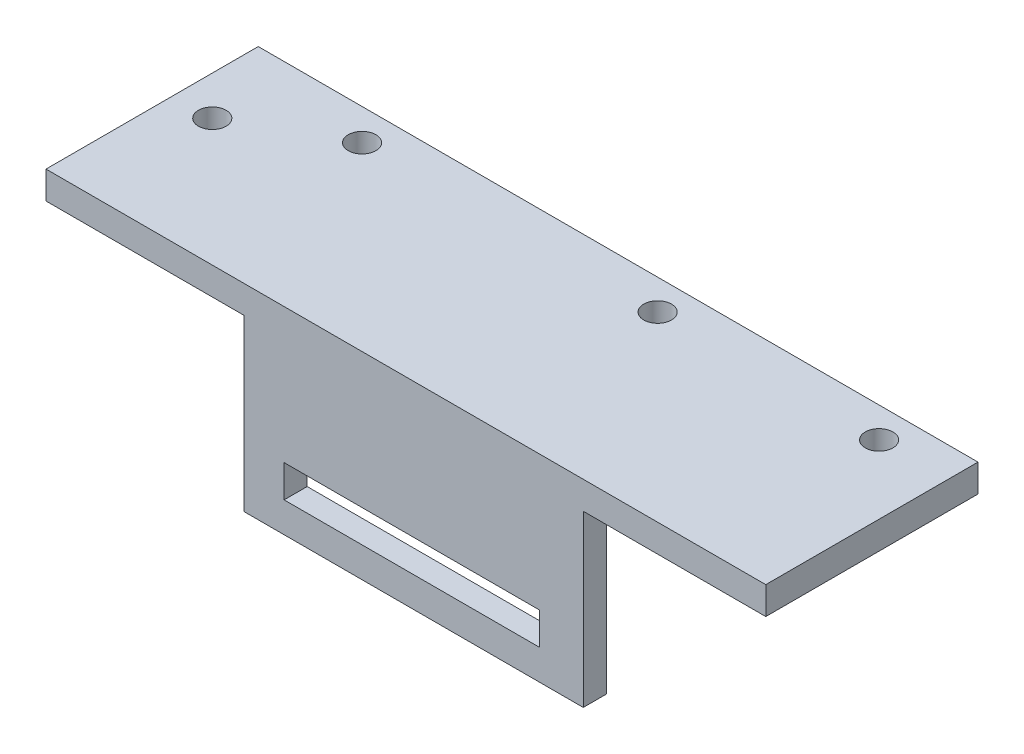
ISO-10303-21;
HEADER;
FILE_DESCRIPTION(('STEP AP214'),'2;1');
FILE_NAME('part.step','',(''),(''),'','','');
FILE_SCHEMA(('AUTOMOTIVE_DESIGN { 1 0 10303 214 1 1 1 1 }'));
ENDSEC;
DATA;
#1=APPLICATION_CONTEXT('core data for automotive mechanical design processes');
#2=APPLICATION_PROTOCOL_DEFINITION('international standard','automotive_design',2000,#1);
#3=PRODUCT_CONTEXT('',#1,'mechanical');
#4=PRODUCT('Part','Part','',(#3));
#5=PRODUCT_RELATED_PRODUCT_CATEGORY('part','',(#4));
#6=PRODUCT_DEFINITION_FORMATION('','',#4);
#7=PRODUCT_DEFINITION_CONTEXT('part definition',#1,'design');
#8=PRODUCT_DEFINITION('design','',#6,#7);
#9=PRODUCT_DEFINITION_SHAPE('','',#8);
#10=(LENGTH_UNIT() NAMED_UNIT(*) SI_UNIT(.MILLI.,.METRE.));
#11=(NAMED_UNIT(*) PLANE_ANGLE_UNIT() SI_UNIT($,.RADIAN.));
#12=(NAMED_UNIT(*) SI_UNIT($,.STERADIAN.) SOLID_ANGLE_UNIT());
#13=UNCERTAINTY_MEASURE_WITH_UNIT(LENGTH_MEASURE(1.E-05),#10,'distance_accuracy_value','');
#14=(GEOMETRIC_REPRESENTATION_CONTEXT(3) GLOBAL_UNCERTAINTY_ASSIGNED_CONTEXT((#13)) GLOBAL_UNIT_ASSIGNED_CONTEXT((#10,
#11,#12)) REPRESENTATION_CONTEXT('',''));
#15=CARTESIAN_POINT('',(0.,0.,0.));
#16=DIRECTION('',(0.,0.,1.));
#17=DIRECTION('',(1.,0.,0.));
#18=AXIS2_PLACEMENT_3D('',#15,#16,#17);
#19=CARTESIAN_POINT('',(0.,0.,0.));
#20=DIRECTION('',(0.,1.,0.));
#21=DIRECTION('',(0.,0.,1.));
#22=AXIS2_PLACEMENT_3D('',#19,#20,#21);
#23=PLANE('',#22);
#24=CARTESIAN_POINT('',(-24.35,0.,-4.1));
#25=DIRECTION('',(0.,1.,0.));
#26=DIRECTION('',(0.,0.,1.));
#27=AXIS2_PLACEMENT_3D('',#24,#25,#26);
#28=CIRCLE('',#27,1.5);
#29=CARTESIAN_POINT('',(-24.35,0.,-2.6));
#30=VERTEX_POINT('',#29);
#31=EDGE_CURVE('E321',#30,#30,#28,.T.);
#32=ORIENTED_EDGE('',*,*,#31,.T.);
#33=EDGE_LOOP('',(#32));
#34=FACE_BOUND('',#33,.T.);
#35=CARTESIAN_POINT('',(31.56,0.,-4.22169208076263));
#36=DIRECTION('',(0.,1.,0.));
#37=DIRECTION('',(0.,0.,1.));
#38=AXIS2_PLACEMENT_3D('',#35,#36,#37);
#39=CIRCLE('',#38,1.5);
#40=CARTESIAN_POINT('',(31.56,0.,-2.72169208076263));
#41=VERTEX_POINT('',#40);
#42=EDGE_CURVE('E314',#41,#41,#39,.T.);
#43=ORIENTED_EDGE('',*,*,#42,.T.);
#44=EDGE_LOOP('',(#43));
#45=FACE_BOUND('',#44,.T.);
#46=CARTESIAN_POINT('',(7.56,0.,-4.22169208076263));
#47=DIRECTION('',(0.,1.,0.));
#48=DIRECTION('',(0.,0.,1.));
#49=AXIS2_PLACEMENT_3D('',#46,#47,#48);
#50=CIRCLE('',#49,1.5);
#51=CARTESIAN_POINT('',(7.56,0.,-2.72169208076263));
#52=VERTEX_POINT('',#51);
#53=EDGE_CURVE('E296',#52,#52,#50,.T.);
#54=ORIENTED_EDGE('',*,*,#53,.T.);
#55=EDGE_LOOP('',(#54));
#56=FACE_BOUND('',#55,.T.);
#57=CARTESIAN_POINT('',(-34.76,0.,1.72));
#58=DIRECTION('',(0.,1.,0.));
#59=DIRECTION('',(0.,0.,1.));
#60=AXIS2_PLACEMENT_3D('',#57,#58,#59);
#61=CIRCLE('',#60,1.5);
#62=CARTESIAN_POINT('',(-34.76,0.,3.22));
#63=VERTEX_POINT('',#62);
#64=EDGE_CURVE('E300',#63,#63,#61,.T.);
#65=ORIENTED_EDGE('',*,*,#64,.T.);
#66=EDGE_LOOP('',(#65));
#67=FACE_BOUND('',#66,.T.);
#68=DIRECTION('',(0.,0.,-1.));
#69=VECTOR('',#68,1.);
#70=CARTESIAN_POINT('',(-17.5447148574661,0.,15.5));
#71=LINE('',#70,#69);
#72=CARTESIAN_POINT('',(-17.5447148574661,0.,15.5));
#73=VERTEX_POINT('',#72);
#74=CARTESIAN_POINT('',(-17.5447148574661,0.,13.));
#75=VERTEX_POINT('',#74);
#76=EDGE_CURVE('E203',#73,#75,#71,.T.);
#77=ORIENTED_EDGE('',*,*,#76,.F.);
#78=DIRECTION('',(-1.,0.,0.));
#79=VECTOR('',#78,1.);
#80=CARTESIAN_POINT('',(-39.,0.,15.5));
#81=LINE('',#80,#79);
#82=CARTESIAN_POINT('',(-39.,0.,15.5));
#83=VERTEX_POINT('',#82);
#84=EDGE_CURVE('E269',#73,#83,#81,.T.);
#85=ORIENTED_EDGE('',*,*,#84,.T.);
#86=DIRECTION('',(0.,0.,-1.));
#87=VECTOR('',#86,1.);
#88=CARTESIAN_POINT('',(-39.,0.,7.5));
#89=LINE('',#88,#87);
#90=CARTESIAN_POINT('',(-39.,0.,-7.5));
#91=VERTEX_POINT('',#90);
#92=EDGE_CURVE('E336',#83,#91,#89,.T.);
#93=ORIENTED_EDGE('',*,*,#92,.T.);
#94=DIRECTION('',(1.,0.,0.));
#95=VECTOR('',#94,1.);
#96=CARTESIAN_POINT('',(-39.,0.,-7.5));
#97=LINE('',#96,#95);
#98=CARTESIAN_POINT('',(39.,0.,-7.5));
#99=VERTEX_POINT('',#98);
#100=EDGE_CURVE('E304',#91,#99,#97,.T.);
#101=ORIENTED_EDGE('',*,*,#100,.T.);
#102=DIRECTION('',(0.,0.,-1.));
#103=VECTOR('',#102,1.);
#104=CARTESIAN_POINT('',(39.,0.,7.5));
#105=LINE('',#104,#103);
#106=CARTESIAN_POINT('',(39.,0.,15.5));
#107=VERTEX_POINT('',#106);
#108=EDGE_CURVE('E347',#107,#99,#105,.T.);
#109=ORIENTED_EDGE('',*,*,#108,.F.);
#110=CARTESIAN_POINT('',(19.2231892448185,0.,15.5));
#111=VERTEX_POINT('',#110);
#112=EDGE_CURVE('E276',#107,#111,#81,.T.);
#113=ORIENTED_EDGE('',*,*,#112,.T.);
#114=DIRECTION('',(0.,0.,1.));
#115=VECTOR('',#114,1.);
#116=CARTESIAN_POINT('',(19.2231892448185,0.,15.5));
#117=LINE('',#116,#115);
#118=CARTESIAN_POINT('',(19.2231892448185,0.,13.));
#119=VERTEX_POINT('',#118);
#120=EDGE_CURVE('E533',#119,#111,#117,.T.);
#121=ORIENTED_EDGE('',*,*,#120,.F.);
#122=DIRECTION('',(1.,0.,0.));
#123=VECTOR('',#122,1.);
#124=CARTESIAN_POINT('',(-17.5447148574661,0.,13.));
#125=LINE('',#124,#123);
#126=EDGE_CURVE('E531',#75,#119,#125,.T.);
#127=ORIENTED_EDGE('',*,*,#126,.F.);
#128=EDGE_LOOP('',(#77,#85,#93,#101,#109,#113,#121,#127));
#129=FACE_BOUND('',#128,.T.);
#130=ADVANCED_FACE('F45',(#34,#45,#56,#67,#129),#23,.F.);
#131=CARTESIAN_POINT('',(-39.,3.,-7.5));
#132=DIRECTION('',(0.,0.,-1.));
#133=DIRECTION('',(-1.,0.,0.));
#134=AXIS2_PLACEMENT_3D('',#131,#132,#133);
#135=PLANE('',#134);
#136=ORIENTED_EDGE('',*,*,#100,.F.);
#137=DIRECTION('',(0.,-1.,0.));
#138=VECTOR('',#137,1.);
#139=CARTESIAN_POINT('',(-39.,3.,-7.5));
#140=LINE('',#139,#138);
#141=CARTESIAN_POINT('',(-39.,3.,-7.5));
#142=VERTEX_POINT('',#141);
#143=EDGE_CURVE('E11',#142,#91,#140,.T.);
#144=ORIENTED_EDGE('',*,*,#143,.F.);
#145=DIRECTION('',(1.,0.,0.));
#146=VECTOR('',#145,1.);
#147=CARTESIAN_POINT('',(-39.,3.,-7.5));
#148=LINE('',#147,#146);
#149=CARTESIAN_POINT('',(39.,3.,-7.5));
#150=VERTEX_POINT('',#149);
#151=EDGE_CURVE('E332',#142,#150,#148,.T.);
#152=ORIENTED_EDGE('',*,*,#151,.T.);
#153=DIRECTION('',(0.,-1.,0.));
#154=VECTOR('',#153,1.);
#155=CARTESIAN_POINT('',(39.,3.,-7.5));
#156=LINE('',#155,#154);
#157=EDGE_CURVE('E55',#150,#99,#156,.T.);
#158=ORIENTED_EDGE('',*,*,#157,.T.);
#159=EDGE_LOOP('',(#136,#144,#152,#158));
#160=FACE_BOUND('',#159,.T.);
#161=ADVANCED_FACE('F47',(#160),#135,.T.);
#162=CARTESIAN_POINT('',(-39.,3.,7.5));
#163=DIRECTION('',(-1.,0.,0.));
#164=DIRECTION('',(0.,0.,1.));
#165=AXIS2_PLACEMENT_3D('',#162,#163,#164);
#166=PLANE('',#165);
#167=ORIENTED_EDGE('',*,*,#92,.F.);
#168=DIRECTION('',(0.,-1.,0.));
#169=VECTOR('',#168,1.);
#170=CARTESIAN_POINT('',(-39.,3.,15.5));
#171=LINE('',#170,#169);
#172=CARTESIAN_POINT('',(-39.,3.,15.5));
#173=VERTEX_POINT('',#172);
#174=EDGE_CURVE('E292',#173,#83,#171,.T.);
#175=ORIENTED_EDGE('',*,*,#174,.F.);
#176=DIRECTION('',(0.,0.,-1.));
#177=VECTOR('',#176,1.);
#178=CARTESIAN_POINT('',(-39.,3.,7.5));
#179=LINE('',#178,#177);
#180=EDGE_CURVE('E340',#173,#142,#179,.T.);
#181=ORIENTED_EDGE('',*,*,#180,.T.);
#182=ORIENTED_EDGE('',*,*,#143,.T.);
#183=EDGE_LOOP('',(#167,#175,#181,#182));
#184=FACE_BOUND('',#183,.T.);
#185=ADVANCED_FACE('F367',(#184),#166,.T.);
#186=CARTESIAN_POINT('',(39.,3.,7.5));
#187=DIRECTION('',(-1.,0.,0.));
#188=DIRECTION('',(0.,0.,1.));
#189=AXIS2_PLACEMENT_3D('',#186,#187,#188);
#190=PLANE('',#189);
#191=ORIENTED_EDGE('',*,*,#108,.T.);
#192=ORIENTED_EDGE('',*,*,#157,.F.);
#193=DIRECTION('',(0.,0.,-1.));
#194=VECTOR('',#193,1.);
#195=CARTESIAN_POINT('',(39.,3.,7.5));
#196=LINE('',#195,#194);
#197=CARTESIAN_POINT('',(39.,3.,15.5));
#198=VERTEX_POINT('',#197);
#199=EDGE_CURVE('E335',#198,#150,#196,.T.);
#200=ORIENTED_EDGE('',*,*,#199,.F.);
#201=DIRECTION('',(0.,-1.,0.));
#202=VECTOR('',#201,1.);
#203=CARTESIAN_POINT('',(39.,3.,15.5));
#204=LINE('',#203,#202);
#205=EDGE_CURVE('E289',#198,#107,#204,.T.);
#206=ORIENTED_EDGE('',*,*,#205,.T.);
#207=EDGE_LOOP('',(#191,#192,#200,#206));
#208=FACE_BOUND('',#207,.T.);
#209=ADVANCED_FACE('F359',(#208),#190,.F.);
#210=CARTESIAN_POINT('',(0.,3.,0.));
#211=DIRECTION('',(0.,1.,0.));
#212=DIRECTION('',(0.,0.,1.));
#213=AXIS2_PLACEMENT_3D('',#210,#211,#212);
#214=PLANE('',#213);
#215=CARTESIAN_POINT('',(7.56,3.,-4.22169208076263));
#216=DIRECTION('',(0.,1.,0.));
#217=DIRECTION('',(0.,0.,1.));
#218=AXIS2_PLACEMENT_3D('',#215,#216,#217);
#219=CIRCLE('',#218,1.5);
#220=CARTESIAN_POINT('',(7.56,3.,-2.72169208076263));
#221=VERTEX_POINT('',#220);
#222=EDGE_CURVE('E310',#221,#221,#219,.T.);
#223=ORIENTED_EDGE('',*,*,#222,.F.);
#224=EDGE_LOOP('',(#223));
#225=FACE_BOUND('',#224,.T.);
#226=ORIENTED_EDGE('',*,*,#180,.F.);
#227=DIRECTION('',(-1.,0.,0.));
#228=VECTOR('',#227,1.);
#229=CARTESIAN_POINT('',(-39.,3.,15.5));
#230=LINE('',#229,#228);
#231=EDGE_CURVE('E286',#198,#173,#230,.T.);
#232=ORIENTED_EDGE('',*,*,#231,.F.);
#233=ORIENTED_EDGE('',*,*,#199,.T.);
#234=ORIENTED_EDGE('',*,*,#151,.F.);
#235=EDGE_LOOP('',(#226,#232,#233,#234));
#236=FACE_BOUND('',#235,.T.);
#237=CARTESIAN_POINT('',(-34.76,3.,1.72));
#238=DIRECTION('',(0.,1.,0.));
#239=DIRECTION('',(0.,0.,1.));
#240=AXIS2_PLACEMENT_3D('',#237,#238,#239);
#241=CIRCLE('',#240,1.5);
#242=CARTESIAN_POINT('',(-34.76,3.,3.22));
#243=VERTEX_POINT('',#242);
#244=EDGE_CURVE('E305',#243,#243,#241,.T.);
#245=ORIENTED_EDGE('',*,*,#244,.F.);
#246=EDGE_LOOP('',(#245));
#247=FACE_BOUND('',#246,.T.);
#248=CARTESIAN_POINT('',(-24.35,3.,-4.1));
#249=DIRECTION('',(0.,1.,0.));
#250=DIRECTION('',(0.,0.,1.));
#251=AXIS2_PLACEMENT_3D('',#248,#249,#250);
#252=CIRCLE('',#251,1.5);
#253=CARTESIAN_POINT('',(-24.35,3.,-2.6));
#254=VERTEX_POINT('',#253);
#255=EDGE_CURVE('E309',#254,#254,#252,.T.);
#256=ORIENTED_EDGE('',*,*,#255,.F.);
#257=EDGE_LOOP('',(#256));
#258=FACE_BOUND('',#257,.T.);
#259=CARTESIAN_POINT('',(31.56,3.,-4.22169208076263));
#260=DIRECTION('',(0.,1.,0.));
#261=DIRECTION('',(0.,0.,1.));
#262=AXIS2_PLACEMENT_3D('',#259,#260,#261);
#263=CIRCLE('',#262,1.5);
#264=CARTESIAN_POINT('',(31.56,3.,-2.72169208076263));
#265=VERTEX_POINT('',#264);
#266=EDGE_CURVE('E325',#265,#265,#263,.T.);
#267=ORIENTED_EDGE('',*,*,#266,.F.);
#268=EDGE_LOOP('',(#267));
#269=FACE_BOUND('',#268,.T.);
#270=ADVANCED_FACE('F371',(#225,#236,#247,#258,#269),#214,.T.);
#271=CARTESIAN_POINT('',(-24.35,0.,-4.1));
#272=DIRECTION('',(0.,1.,0.));
#273=DIRECTION('',(0.,0.,1.));
#274=AXIS2_PLACEMENT_3D('',#271,#272,#273);
#275=CYLINDRICAL_SURFACE('',#274,1.5);
#276=ORIENTED_EDGE('',*,*,#31,.F.);
#277=EDGE_LOOP('',(#276));
#278=FACE_BOUND('',#277,.T.);
#279=ORIENTED_EDGE('',*,*,#255,.T.);
#280=EDGE_LOOP('',(#279));
#281=FACE_BOUND('',#280,.T.);
#282=ADVANCED_FACE('F374',(#278,#281),#275,.F.);
#283=CARTESIAN_POINT('',(31.56,0.,-4.22169208076263));
#284=DIRECTION('',(0.,1.,0.));
#285=DIRECTION('',(0.,0.,1.));
#286=AXIS2_PLACEMENT_3D('',#283,#284,#285);
#287=CYLINDRICAL_SURFACE('',#286,1.5);
#288=ORIENTED_EDGE('',*,*,#42,.F.);
#289=EDGE_LOOP('',(#288));
#290=FACE_BOUND('',#289,.T.);
#291=ORIENTED_EDGE('',*,*,#266,.T.);
#292=EDGE_LOOP('',(#291));
#293=FACE_BOUND('',#292,.T.);
#294=ADVANCED_FACE('F383',(#290,#293),#287,.F.);
#295=CARTESIAN_POINT('',(7.56,0.,-4.22169208076263));
#296=DIRECTION('',(0.,1.,0.));
#297=DIRECTION('',(0.,0.,1.));
#298=AXIS2_PLACEMENT_3D('',#295,#296,#297);
#299=CYLINDRICAL_SURFACE('',#298,1.5);
#300=ORIENTED_EDGE('',*,*,#53,.F.);
#301=EDGE_LOOP('',(#300));
#302=FACE_BOUND('',#301,.T.);
#303=ORIENTED_EDGE('',*,*,#222,.T.);
#304=EDGE_LOOP('',(#303));
#305=FACE_BOUND('',#304,.T.);
#306=ADVANCED_FACE('F385',(#302,#305),#299,.F.);
#307=CARTESIAN_POINT('',(-34.76,0.,1.72));
#308=DIRECTION('',(0.,1.,0.));
#309=DIRECTION('',(0.,0.,1.));
#310=AXIS2_PLACEMENT_3D('',#307,#308,#309);
#311=CYLINDRICAL_SURFACE('',#310,1.5);
#312=ORIENTED_EDGE('',*,*,#64,.F.);
#313=EDGE_LOOP('',(#312));
#314=FACE_BOUND('',#313,.T.);
#315=ORIENTED_EDGE('',*,*,#244,.T.);
#316=EDGE_LOOP('',(#315));
#317=FACE_BOUND('',#316,.T.);
#318=ADVANCED_FACE('F393',(#314,#317),#311,.F.);
#319=CARTESIAN_POINT('',(-39.,3.,15.5));
#320=DIRECTION('',(0.,0.,1.));
#321=DIRECTION('',(1.,0.,0.));
#322=AXIS2_PLACEMENT_3D('',#319,#320,#321);
#323=PLANE('',#322);
#324=DIRECTION('',(0.,-1.,0.));
#325=VECTOR('',#324,1.);
#326=CARTESIAN_POINT('',(14.4639339658686,-11.6441908273902,15.5));
#327=LINE('',#326,#325);
#328=CARTESIAN_POINT('',(14.4639339658686,-11.6441908273902,15.5));
#329=VERTEX_POINT('',#328);
#330=CARTESIAN_POINT('',(14.4639339658686,-15.1441908273902,15.5));
#331=VERTEX_POINT('',#330);
#332=EDGE_CURVE('E144',#329,#331,#327,.T.);
#333=ORIENTED_EDGE('',*,*,#332,.T.);
#334=DIRECTION('',(-1.,0.,0.));
#335=VECTOR('',#334,1.);
#336=CARTESIAN_POINT('',(14.4639339658686,-15.1441908273902,15.5));
#337=LINE('',#336,#335);
#338=CARTESIAN_POINT('',(-13.1964064492373,-15.1441908273902,15.5));
#339=VERTEX_POINT('',#338);
#340=EDGE_CURVE('E154',#331,#339,#337,.T.);
#341=ORIENTED_EDGE('',*,*,#340,.T.);
#342=DIRECTION('',(0.,1.,0.));
#343=VECTOR('',#342,1.);
#344=CARTESIAN_POINT('',(-13.1964064492373,-11.6441908273902,15.5));
#345=LINE('',#344,#343);
#346=CARTESIAN_POINT('',(-13.1964064492373,-11.6441908273902,15.5));
#347=VERTEX_POINT('',#346);
#348=EDGE_CURVE('E63',#339,#347,#345,.T.);
#349=ORIENTED_EDGE('',*,*,#348,.T.);
#350=DIRECTION('',(1.,0.,0.));
#351=VECTOR('',#350,1.);
#352=CARTESIAN_POINT('',(14.4639339658686,-11.6441908273902,15.5));
#353=LINE('',#352,#351);
#354=EDGE_CURVE('E151',#347,#329,#353,.T.);
#355=ORIENTED_EDGE('',*,*,#354,.T.);
#356=EDGE_LOOP('',(#333,#341,#349,#355));
#357=FACE_BOUND('',#356,.T.);
#358=ORIENTED_EDGE('',*,*,#112,.F.);
#359=ORIENTED_EDGE('',*,*,#205,.F.);
#360=ORIENTED_EDGE('',*,*,#231,.T.);
#361=ORIENTED_EDGE('',*,*,#174,.T.);
#362=ORIENTED_EDGE('',*,*,#84,.F.);
#363=DIRECTION('',(0.,1.,0.));
#364=VECTOR('',#363,1.);
#365=CARTESIAN_POINT('',(-17.5447148574661,-12.5,15.5));
#366=LINE('',#365,#364);
#367=CARTESIAN_POINT('',(-17.5443783833393,-12.5,15.5));
#368=VERTEX_POINT('',#367);
#369=EDGE_CURVE('E255',#368,#73,#366,.T.);
#370=ORIENTED_EDGE('',*,*,#369,.F.);
#371=DIRECTION('',(0.,1.,0.));
#372=VECTOR('',#371,1.);
#373=CARTESIAN_POINT('',(-17.5440419092125,-12.5,15.5));
#374=LINE('',#373,#372);
#375=CARTESIAN_POINT('',(-17.5440419092125,-18.4181954398679,15.5));
#376=VERTEX_POINT('',#375);
#377=EDGE_CURVE('E195',#376,#368,#374,.T.);
#378=ORIENTED_EDGE('',*,*,#377,.F.);
#379=DIRECTION('',(-1.,0.,0.));
#380=VECTOR('',#379,1.);
#381=CARTESIAN_POINT('',(19.2231892448185,-18.4181954398679,15.5));
#382=LINE('',#381,#380);
#383=CARTESIAN_POINT('',(19.2231892448185,-18.4181954398679,15.5));
#384=VERTEX_POINT('',#383);
#385=EDGE_CURVE('E191',#384,#376,#382,.T.);
#386=ORIENTED_EDGE('',*,*,#385,.F.);
#387=DIRECTION('',(0.,1.,0.));
#388=VECTOR('',#387,1.);
#389=CARTESIAN_POINT('',(19.2231892448185,-12.5,15.5));
#390=LINE('',#389,#388);
#391=EDGE_CURVE('E264',#384,#111,#390,.T.);
#392=ORIENTED_EDGE('',*,*,#391,.T.);
#393=EDGE_LOOP('',(#358,#359,#360,#361,#362,#370,#378,#386,#392));
#394=FACE_BOUND('',#393,.T.);
#395=ADVANCED_FACE('F159',(#357,#394),#323,.T.);
#396=CARTESIAN_POINT('',(-17.5447148574661,-12.5,15.5));
#397=DIRECTION('',(1.,0.,0.));
#398=DIRECTION('',(0.,0.,-1.));
#399=AXIS2_PLACEMENT_3D('',#396,#397,#398);
#400=PLANE('',#399);
#401=ORIENTED_EDGE('',*,*,#76,.T.);
#402=DIRECTION('',(0.,1.,0.));
#403=VECTOR('',#402,1.);
#404=CARTESIAN_POINT('',(-17.5447148574661,-12.5,13.));
#405=LINE('',#404,#403);
#406=CARTESIAN_POINT('',(-17.5443783833393,-12.5,13.));
#407=VERTEX_POINT('',#406);
#408=EDGE_CURVE('E266',#407,#75,#405,.T.);
#409=ORIENTED_EDGE('',*,*,#408,.F.);
#410=CARTESIAN_POINT('',(-17.5440419092125,-12.5,15.5));
#411=DIRECTION('',(0.,0.,-1.));
#412=VECTOR('',#411,1.);
#413=LINE('',#410,#412);
#414=EDGE_CURVE('E213',#368,#407,#413,.T.);
#415=ORIENTED_EDGE('',*,*,#414,.F.);
#416=ORIENTED_EDGE('',*,*,#369,.T.);
#417=EDGE_LOOP('',(#401,#409,#415,#416));
#418=FACE_BOUND('',#417,.T.);
#419=ADVANCED_FACE('F242',(#418),#400,.F.);
#420=CARTESIAN_POINT('',(-17.5447148574661,-12.5,13.));
#421=DIRECTION('',(0.,0.,1.));
#422=DIRECTION('',(1.,0.,0.));
#423=AXIS2_PLACEMENT_3D('',#420,#421,#422);
#424=PLANE('',#423);
#425=DIRECTION('',(-1.,0.,0.));
#426=VECTOR('',#425,1.);
#427=CARTESIAN_POINT('',(14.4639339658686,-15.1441908273902,13.));
#428=LINE('',#427,#426);
#429=CARTESIAN_POINT('',(14.4639339658686,-15.1441908273902,13.));
#430=VERTEX_POINT('',#429);
#431=CARTESIAN_POINT('',(-13.1964064492373,-15.1441908273902,13.));
#432=VERTEX_POINT('',#431);
#433=EDGE_CURVE('E176',#430,#432,#428,.T.);
#434=ORIENTED_EDGE('',*,*,#433,.F.);
#435=DIRECTION('',(0.,-1.,0.));
#436=VECTOR('',#435,1.);
#437=CARTESIAN_POINT('',(14.4639339658686,-11.6441908273902,13.));
#438=LINE('',#437,#436);
#439=CARTESIAN_POINT('',(14.4639339658686,-11.6441908273902,13.));
#440=VERTEX_POINT('',#439);
#441=EDGE_CURVE('E71',#440,#430,#438,.T.);
#442=ORIENTED_EDGE('',*,*,#441,.F.);
#443=DIRECTION('',(1.,0.,0.));
#444=VECTOR('',#443,1.);
#445=CARTESIAN_POINT('',(14.4639339658686,-11.6441908273902,13.));
#446=LINE('',#445,#444);
#447=CARTESIAN_POINT('',(-13.1964064492373,-11.6441908273902,13.));
#448=VERTEX_POINT('',#447);
#449=EDGE_CURVE('E163',#448,#440,#446,.T.);
#450=ORIENTED_EDGE('',*,*,#449,.F.);
#451=DIRECTION('',(0.,1.,0.));
#452=VECTOR('',#451,1.);
#453=CARTESIAN_POINT('',(-13.1964064492373,-11.6441908273902,13.));
#454=LINE('',#453,#452);
#455=EDGE_CURVE('E167',#432,#448,#454,.T.);
#456=ORIENTED_EDGE('',*,*,#455,.F.);
#457=EDGE_LOOP('',(#434,#442,#450,#456));
#458=FACE_BOUND('',#457,.T.);
#459=ORIENTED_EDGE('',*,*,#126,.T.);
#460=DIRECTION('',(0.,1.,0.));
#461=VECTOR('',#460,1.);
#462=CARTESIAN_POINT('',(19.2231892448185,-12.5,13.));
#463=LINE('',#462,#461);
#464=CARTESIAN_POINT('',(19.2231892448185,-18.4181954398679,13.));
#465=VERTEX_POINT('',#464);
#466=EDGE_CURVE('E270',#465,#119,#463,.T.);
#467=ORIENTED_EDGE('',*,*,#466,.F.);
#468=DIRECTION('',(-1.,0.,0.));
#469=VECTOR('',#468,1.);
#470=CARTESIAN_POINT('',(19.2231892448185,-18.4181954398679,13.));
#471=LINE('',#470,#469);
#472=CARTESIAN_POINT('',(-17.5440419092125,-18.4181954398679,13.));
#473=VERTEX_POINT('',#472);
#474=EDGE_CURVE('E185',#465,#473,#471,.T.);
#475=ORIENTED_EDGE('',*,*,#474,.T.);
#476=DIRECTION('',(0.,1.,0.));
#477=VECTOR('',#476,1.);
#478=CARTESIAN_POINT('',(-17.5440419092125,-12.5,13.));
#479=LINE('',#478,#477);
#480=EDGE_CURVE('E196',#473,#407,#479,.T.);
#481=ORIENTED_EDGE('',*,*,#480,.T.);
#482=ORIENTED_EDGE('',*,*,#408,.T.);
#483=EDGE_LOOP('',(#459,#467,#475,#481,#482));
#484=FACE_BOUND('',#483,.T.);
#485=ADVANCED_FACE('F238',(#458,#484),#424,.F.);
#486=CARTESIAN_POINT('',(19.2231892448185,-12.5,15.5));
#487=DIRECTION('',(-1.,0.,0.));
#488=DIRECTION('',(0.,0.,1.));
#489=AXIS2_PLACEMENT_3D('',#486,#487,#488);
#490=PLANE('',#489);
#491=ORIENTED_EDGE('',*,*,#120,.T.);
#492=ORIENTED_EDGE('',*,*,#391,.F.);
#493=DIRECTION('',(0.,0.,-1.));
#494=VECTOR('',#493,1.);
#495=CARTESIAN_POINT('',(19.2231892448185,-18.4181954398679,15.5));
#496=LINE('',#495,#494);
#497=EDGE_CURVE('E204',#384,#465,#496,.T.);
#498=ORIENTED_EDGE('',*,*,#497,.T.);
#499=ORIENTED_EDGE('',*,*,#466,.T.);
#500=EDGE_LOOP('',(#491,#492,#498,#499));
#501=FACE_BOUND('',#500,.T.);
#502=ADVANCED_FACE('F231',(#501),#490,.F.);
#503=CARTESIAN_POINT('',(-17.5440419092125,-12.5,15.5));
#504=DIRECTION('',(-1.,0.,0.));
#505=DIRECTION('',(0.,0.,1.));
#506=AXIS2_PLACEMENT_3D('',#503,#504,#505);
#507=PLANE('',#506);
#508=ORIENTED_EDGE('',*,*,#480,.F.);
#509=DIRECTION('',(0.,0.,-1.));
#510=VECTOR('',#509,1.);
#511=CARTESIAN_POINT('',(-17.5440419092125,-18.4181954398679,15.5));
#512=LINE('',#511,#510);
#513=EDGE_CURVE('E200',#376,#473,#512,.T.);
#514=ORIENTED_EDGE('',*,*,#513,.F.);
#515=ORIENTED_EDGE('',*,*,#377,.T.);
#516=ORIENTED_EDGE('',*,*,#414,.T.);
#517=EDGE_LOOP('',(#508,#514,#515,#516));
#518=FACE_BOUND('',#517,.T.);
#519=ADVANCED_FACE('F220',(#518),#507,.T.);
#520=CARTESIAN_POINT('',(19.2231892448185,-18.4181954398679,15.5));
#521=DIRECTION('',(0.,-1.,0.));
#522=DIRECTION('',(0.,0.,-1.));
#523=AXIS2_PLACEMENT_3D('',#520,#521,#522);
#524=PLANE('',#523);
#525=ORIENTED_EDGE('',*,*,#474,.F.);
#526=ORIENTED_EDGE('',*,*,#497,.F.);
#527=ORIENTED_EDGE('',*,*,#385,.T.);
#528=ORIENTED_EDGE('',*,*,#513,.T.);
#529=EDGE_LOOP('',(#525,#526,#527,#528));
#530=FACE_BOUND('',#529,.T.);
#531=ADVANCED_FACE('F230',(#530),#524,.T.);
#532=CARTESIAN_POINT('',(14.4639339658686,-11.6441908273902,15.5));
#533=DIRECTION('',(1.,0.,0.));
#534=DIRECTION('',(0.,0.,-1.));
#535=AXIS2_PLACEMENT_3D('',#532,#533,#534);
#536=PLANE('',#535);
#537=ORIENTED_EDGE('',*,*,#441,.T.);
#538=DIRECTION('',(0.,0.,-1.));
#539=VECTOR('',#538,1.);
#540=CARTESIAN_POINT('',(14.4639339658686,-15.1441908273902,15.5));
#541=LINE('',#540,#539);
#542=EDGE_CURVE('E140',#331,#430,#541,.T.);
#543=ORIENTED_EDGE('',*,*,#542,.F.);
#544=ORIENTED_EDGE('',*,*,#332,.F.);
#545=DIRECTION('',(0.,0.,-1.));
#546=VECTOR('',#545,1.);
#547=CARTESIAN_POINT('',(14.4639339658686,-11.6441908273902,15.5));
#548=LINE('',#547,#546);
#549=EDGE_CURVE('E182',#329,#440,#548,.T.);
#550=ORIENTED_EDGE('',*,*,#549,.T.);
#551=EDGE_LOOP('',(#537,#543,#544,#550));
#552=FACE_BOUND('',#551,.T.);
#553=ADVANCED_FACE('F142',(#552),#536,.F.);
#554=CARTESIAN_POINT('',(14.4639339658686,-11.6441908273902,15.5));
#555=DIRECTION('',(0.,1.,0.));
#556=DIRECTION('',(0.,0.,1.));
#557=AXIS2_PLACEMENT_3D('',#554,#555,#556);
#558=PLANE('',#557);
#559=ORIENTED_EDGE('',*,*,#449,.T.);
#560=ORIENTED_EDGE('',*,*,#549,.F.);
#561=ORIENTED_EDGE('',*,*,#354,.F.);
#562=DIRECTION('',(0.,0.,-1.));
#563=VECTOR('',#562,1.);
#564=CARTESIAN_POINT('',(-13.1964064492373,-11.6441908273902,15.5));
#565=LINE('',#564,#563);
#566=EDGE_CURVE('E186',#347,#448,#565,.T.);
#567=ORIENTED_EDGE('',*,*,#566,.T.);
#568=EDGE_LOOP('',(#559,#560,#561,#567));
#569=FACE_BOUND('',#568,.T.);
#570=ADVANCED_FACE('F477',(#569),#558,.F.);
#571=CARTESIAN_POINT('',(-13.1964064492373,-11.6441908273902,15.5));
#572=DIRECTION('',(-1.,0.,0.));
#573=DIRECTION('',(0.,0.,1.));
#574=AXIS2_PLACEMENT_3D('',#571,#572,#573);
#575=PLANE('',#574);
#576=ORIENTED_EDGE('',*,*,#455,.T.);
#577=ORIENTED_EDGE('',*,*,#566,.F.);
#578=ORIENTED_EDGE('',*,*,#348,.F.);
#579=DIRECTION('',(0.,0.,-1.));
#580=VECTOR('',#579,1.);
#581=CARTESIAN_POINT('',(-13.1964064492373,-15.1441908273902,15.5));
#582=LINE('',#581,#580);
#583=EDGE_CURVE('E150',#339,#432,#582,.T.);
#584=ORIENTED_EDGE('',*,*,#583,.T.);
#585=EDGE_LOOP('',(#576,#577,#578,#584));
#586=FACE_BOUND('',#585,.T.);
#587=ADVANCED_FACE('F484',(#586),#575,.F.);
#588=CARTESIAN_POINT('',(14.4639339658686,-15.1441908273902,15.5));
#589=DIRECTION('',(0.,-1.,0.));
#590=DIRECTION('',(0.,0.,-1.));
#591=AXIS2_PLACEMENT_3D('',#588,#589,#590);
#592=PLANE('',#591);
#593=ORIENTED_EDGE('',*,*,#433,.T.);
#594=ORIENTED_EDGE('',*,*,#583,.F.);
#595=ORIENTED_EDGE('',*,*,#340,.F.);
#596=ORIENTED_EDGE('',*,*,#542,.T.);
#597=EDGE_LOOP('',(#593,#594,#595,#596));
#598=FACE_BOUND('',#597,.T.);
#599=ADVANCED_FACE('F155',(#598),#592,.F.);
#600=CLOSED_SHELL('',(#130,#161,#185,#209,#270,#282,#294,#306,#318,#395,#419,#485,#502,#519,
#531,#553,#570,#587,#599));
#601=MANIFOLD_SOLID_BREP('B2',#600);
#602=ADVANCED_BREP_SHAPE_REPRESENTATION('',(#18,#601),#14);
#603=SHAPE_DEFINITION_REPRESENTATION(#9,#602);
ENDSEC;
END-ISO-10303-21;
